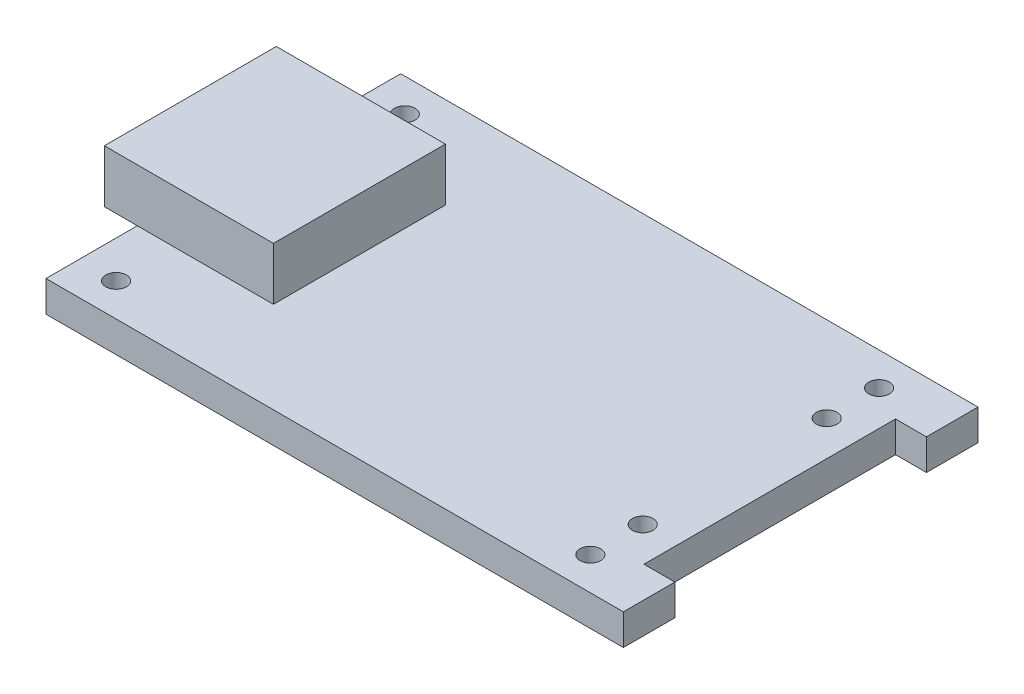
ISO-10303-21;
HEADER;
FILE_DESCRIPTION(('STEP AP214'),'2;1');
FILE_NAME('part.step','',(''),(''),'','','');
FILE_SCHEMA(('AUTOMOTIVE_DESIGN { 1 0 10303 214 1 1 1 1 }'));
ENDSEC;
DATA;
#1=APPLICATION_CONTEXT('core data for automotive mechanical design processes');
#2=APPLICATION_PROTOCOL_DEFINITION('international standard','automotive_design',2000,#1);
#3=PRODUCT_CONTEXT('',#1,'mechanical');
#4=PRODUCT('Part','Part','',(#3));
#5=PRODUCT_RELATED_PRODUCT_CATEGORY('part','',(#4));
#6=PRODUCT_DEFINITION_FORMATION('','',#4);
#7=PRODUCT_DEFINITION_CONTEXT('part definition',#1,'design');
#8=PRODUCT_DEFINITION('design','',#6,#7);
#9=PRODUCT_DEFINITION_SHAPE('','',#8);
#10=(LENGTH_UNIT() NAMED_UNIT(*) SI_UNIT(.MILLI.,.METRE.));
#11=(NAMED_UNIT(*) PLANE_ANGLE_UNIT() SI_UNIT($,.RADIAN.));
#12=(NAMED_UNIT(*) SI_UNIT($,.STERADIAN.) SOLID_ANGLE_UNIT());
#13=UNCERTAINTY_MEASURE_WITH_UNIT(LENGTH_MEASURE(1.E-05),#10,'distance_accuracy_value','');
#14=(GEOMETRIC_REPRESENTATION_CONTEXT(3) GLOBAL_UNCERTAINTY_ASSIGNED_CONTEXT((#13)) GLOBAL_UNIT_ASSIGNED_CONTEXT((#10,
#11,#12)) REPRESENTATION_CONTEXT('',''));
#15=CARTESIAN_POINT('',(0.,0.,0.));
#16=DIRECTION('',(0.,0.,1.));
#17=DIRECTION('',(1.,0.,0.));
#18=AXIS2_PLACEMENT_3D('',#15,#16,#17);
#19=CARTESIAN_POINT('',(28.,1.5,0.));
#20=DIRECTION('',(-1.,0.,0.));
#21=DIRECTION('',(0.,0.,1.));
#22=AXIS2_PLACEMENT_3D('',#19,#20,#21);
#23=PLANE('',#22);
#24=DIRECTION('',(0.,0.,-1.));
#25=VECTOR('',#24,1.);
#26=CARTESIAN_POINT('',(28.,0.,0.));
#27=LINE('',#26,#25);
#28=CARTESIAN_POINT('',(28.,0.,17.2));
#29=VERTEX_POINT('',#28);
#30=CARTESIAN_POINT('',(28.,0.,14.7));
#31=VERTEX_POINT('',#30);
#32=EDGE_CURVE('E177',#29,#31,#27,.T.);
#33=ORIENTED_EDGE('',*,*,#32,.T.);
#34=DIRECTION('',(0.,1.,0.));
#35=VECTOR('',#34,1.);
#36=CARTESIAN_POINT('',(28.,-8.5,14.7));
#37=LINE('',#36,#35);
#38=CARTESIAN_POINT('',(28.,1.5,14.7));
#39=VERTEX_POINT('',#38);
#40=EDGE_CURVE('E222',#31,#39,#37,.T.);
#41=ORIENTED_EDGE('',*,*,#40,.T.);
#42=DIRECTION('',(0.,0.,-1.));
#43=VECTOR('',#42,1.);
#44=CARTESIAN_POINT('',(28.,1.5,0.));
#45=LINE('',#44,#43);
#46=CARTESIAN_POINT('',(28.,1.5,17.2));
#47=VERTEX_POINT('',#46);
#48=EDGE_CURVE('E159',#47,#39,#45,.T.);
#49=ORIENTED_EDGE('',*,*,#48,.F.);
#50=DIRECTION('',(0.,-1.,0.));
#51=VECTOR('',#50,1.);
#52=CARTESIAN_POINT('',(28.,1.5,17.2));
#53=LINE('',#52,#51);
#54=EDGE_CURVE('E186',#47,#29,#53,.T.);
#55=ORIENTED_EDGE('',*,*,#54,.T.);
#56=EDGE_LOOP('',(#33,#41,#49,#55));
#57=FACE_BOUND('',#56,.T.);
#58=ADVANCED_FACE('F41',(#57),#23,.F.);
#59=CARTESIAN_POINT('',(0.,1.5,0.));
#60=DIRECTION('',(1.,0.,0.));
#61=DIRECTION('',(0.,0.,-1.));
#62=AXIS2_PLACEMENT_3D('',#59,#60,#61);
#63=PLANE('',#62);
#64=DIRECTION('',(0.,0.,1.));
#65=VECTOR('',#64,1.);
#66=CARTESIAN_POINT('',(0.,0.,0.));
#67=LINE('',#66,#65);
#68=CARTESIAN_POINT('',(0.,0.,0.));
#69=VERTEX_POINT('',#68);
#70=CARTESIAN_POINT('',(0.,0.,17.2));
#71=VERTEX_POINT('',#70);
#72=EDGE_CURVE('E170',#69,#71,#67,.T.);
#73=ORIENTED_EDGE('',*,*,#72,.T.);
#74=DIRECTION('',(0.,-1.,0.));
#75=VECTOR('',#74,1.);
#76=CARTESIAN_POINT('',(0.,1.5,17.2));
#77=LINE('',#76,#75);
#78=CARTESIAN_POINT('',(0.,1.5,17.2));
#79=VERTEX_POINT('',#78);
#80=EDGE_CURVE('E189',#79,#71,#77,.T.);
#81=ORIENTED_EDGE('',*,*,#80,.F.);
#82=DIRECTION('',(0.,0.,1.));
#83=VECTOR('',#82,1.);
#84=CARTESIAN_POINT('',(0.,1.5,0.));
#85=LINE('',#84,#83);
#86=CARTESIAN_POINT('',(0.,1.5,12.77));
#87=VERTEX_POINT('',#86);
#88=EDGE_CURVE('E182',#87,#79,#85,.T.);
#89=ORIENTED_EDGE('',*,*,#88,.F.);
#90=CARTESIAN_POINT('',(0.,1.5,4.43));
#91=VERTEX_POINT('',#90);
#92=EDGE_CURVE('E274',#91,#87,#85,.T.);
#93=ORIENTED_EDGE('',*,*,#92,.F.);
#94=CARTESIAN_POINT('',(0.,1.5,0.));
#95=VERTEX_POINT('',#94);
#96=EDGE_CURVE('E164',#95,#91,#85,.T.);
#97=ORIENTED_EDGE('',*,*,#96,.F.);
#98=DIRECTION('',(0.,-1.,0.));
#99=VECTOR('',#98,1.);
#100=CARTESIAN_POINT('',(0.,1.5,0.));
#101=LINE('',#100,#99);
#102=EDGE_CURVE('E169',#95,#69,#101,.T.);
#103=ORIENTED_EDGE('',*,*,#102,.T.);
#104=EDGE_LOOP('',(#73,#81,#89,#93,#97,#103));
#105=FACE_BOUND('',#104,.T.);
#106=ADVANCED_FACE('F43',(#105),#63,.F.);
#107=CARTESIAN_POINT('',(0.,1.5,17.2));
#108=DIRECTION('',(0.,0.,-1.));
#109=DIRECTION('',(-1.,0.,0.));
#110=AXIS2_PLACEMENT_3D('',#107,#108,#109);
#111=PLANE('',#110);
#112=DIRECTION('',(1.,0.,0.));
#113=VECTOR('',#112,1.);
#114=CARTESIAN_POINT('',(0.,0.,17.2));
#115=LINE('',#114,#113);
#116=EDGE_CURVE('E173',#71,#29,#115,.T.);
#117=ORIENTED_EDGE('',*,*,#116,.T.);
#118=ORIENTED_EDGE('',*,*,#54,.F.);
#119=DIRECTION('',(1.,0.,0.));
#120=VECTOR('',#119,1.);
#121=CARTESIAN_POINT('',(0.,1.5,17.2));
#122=LINE('',#121,#120);
#123=EDGE_CURVE('E160',#79,#47,#122,.T.);
#124=ORIENTED_EDGE('',*,*,#123,.F.);
#125=ORIENTED_EDGE('',*,*,#80,.T.);
#126=EDGE_LOOP('',(#117,#118,#124,#125));
#127=FACE_BOUND('',#126,.T.);
#128=ADVANCED_FACE('F285',(#127),#111,.F.);
#129=CARTESIAN_POINT('',(28.,1.5,2.5));
#130=VERTEX_POINT('',#129);
#131=CARTESIAN_POINT('',(28.,1.5,0.));
#132=VERTEX_POINT('',#131);
#133=EDGE_CURVE('E150',#130,#132,#45,.T.);
#134=ORIENTED_EDGE('',*,*,#133,.F.);
#135=DIRECTION('',(0.,1.,0.));
#136=VECTOR('',#135,1.);
#137=CARTESIAN_POINT('',(28.,-8.5,2.5));
#138=LINE('',#137,#136);
#139=CARTESIAN_POINT('',(28.,0.,2.5));
#140=VERTEX_POINT('',#139);
#141=EDGE_CURVE('E135',#140,#130,#138,.T.);
#142=ORIENTED_EDGE('',*,*,#141,.F.);
#143=CARTESIAN_POINT('',(28.,0.,0.));
#144=VERTEX_POINT('',#143);
#145=EDGE_CURVE('E176',#140,#144,#27,.T.);
#146=ORIENTED_EDGE('',*,*,#145,.T.);
#147=DIRECTION('',(0.,-1.,0.));
#148=VECTOR('',#147,1.);
#149=CARTESIAN_POINT('',(28.,1.5,0.));
#150=LINE('',#149,#148);
#151=EDGE_CURVE('E157',#132,#144,#150,.T.);
#152=ORIENTED_EDGE('',*,*,#151,.F.);
#153=EDGE_LOOP('',(#134,#142,#146,#152));
#154=FACE_BOUND('',#153,.T.);
#155=ADVANCED_FACE('F155',(#154),#23,.F.);
#156=CARTESIAN_POINT('',(0.,1.5,0.));
#157=DIRECTION('',(0.,0.,1.));
#158=DIRECTION('',(1.,0.,0.));
#159=AXIS2_PLACEMENT_3D('',#156,#157,#158);
#160=PLANE('',#159);
#161=DIRECTION('',(-1.,0.,0.));
#162=VECTOR('',#161,1.);
#163=CARTESIAN_POINT('',(0.,0.,0.));
#164=LINE('',#163,#162);
#165=EDGE_CURVE('E180',#144,#69,#164,.T.);
#166=ORIENTED_EDGE('',*,*,#165,.T.);
#167=ORIENTED_EDGE('',*,*,#102,.F.);
#168=DIRECTION('',(-1.,0.,0.));
#169=VECTOR('',#168,1.);
#170=CARTESIAN_POINT('',(0.,1.5,0.));
#171=LINE('',#170,#169);
#172=EDGE_CURVE('E163',#132,#95,#171,.T.);
#173=ORIENTED_EDGE('',*,*,#172,.F.);
#174=ORIENTED_EDGE('',*,*,#151,.T.);
#175=EDGE_LOOP('',(#166,#167,#173,#174));
#176=FACE_BOUND('',#175,.T.);
#177=ADVANCED_FACE('F312',(#176),#160,.F.);
#178=CARTESIAN_POINT('',(0.,1.5,0.));
#179=DIRECTION('',(0.,1.,0.));
#180=DIRECTION('',(0.,0.,1.));
#181=AXIS2_PLACEMENT_3D('',#178,#179,#180);
#182=PLANE('',#181);
#183=DIRECTION('',(1.,0.,0.));
#184=VECTOR('',#183,1.);
#185=CARTESIAN_POINT('',(26.5,1.5,14.7));
#186=LINE('',#185,#184);
#187=CARTESIAN_POINT('',(26.5,1.5,14.7));
#188=VERTEX_POINT('',#187);
#189=EDGE_CURVE('E145',#188,#39,#186,.T.);
#190=ORIENTED_EDGE('',*,*,#189,.F.);
#191=DIRECTION('',(0.,0.,1.));
#192=VECTOR('',#191,1.);
#193=CARTESIAN_POINT('',(26.5,1.5,2.5));
#194=LINE('',#193,#192);
#195=CARTESIAN_POINT('',(26.5,1.5,2.5));
#196=VERTEX_POINT('',#195);
#197=EDGE_CURVE('E153',#196,#188,#194,.T.);
#198=ORIENTED_EDGE('',*,*,#197,.F.);
#199=DIRECTION('',(-1.,0.,0.));
#200=VECTOR('',#199,1.);
#201=CARTESIAN_POINT('',(28.,1.5,2.5));
#202=LINE('',#201,#200);
#203=EDGE_CURVE('E138',#130,#196,#202,.T.);
#204=ORIENTED_EDGE('',*,*,#203,.F.);
#205=ORIENTED_EDGE('',*,*,#133,.T.);
#206=ORIENTED_EDGE('',*,*,#172,.T.);
#207=ORIENTED_EDGE('',*,*,#96,.T.);
#208=DIRECTION('',(-1.,0.,0.));
#209=VECTOR('',#208,1.);
#210=CARTESIAN_POINT('',(-1.6,1.5,4.43));
#211=LINE('',#210,#209);
#212=CARTESIAN_POINT('',(6.6,1.5,4.43));
#213=VERTEX_POINT('',#212);
#214=EDGE_CURVE('E64',#213,#91,#211,.T.);
#215=ORIENTED_EDGE('',*,*,#214,.F.);
#216=DIRECTION('',(0.,0.,-1.));
#217=VECTOR('',#216,1.);
#218=CARTESIAN_POINT('',(6.6,1.5,4.43));
#219=LINE('',#218,#217);
#220=CARTESIAN_POINT('',(6.6,1.5,12.77));
#221=VERTEX_POINT('',#220);
#222=EDGE_CURVE('E261',#221,#213,#219,.T.);
#223=ORIENTED_EDGE('',*,*,#222,.F.);
#224=DIRECTION('',(1.,0.,0.));
#225=VECTOR('',#224,1.);
#226=CARTESIAN_POINT('',(-1.6,1.5,12.77));
#227=LINE('',#226,#225);
#228=EDGE_CURVE('E192',#87,#221,#227,.T.);
#229=ORIENTED_EDGE('',*,*,#228,.F.);
#230=ORIENTED_EDGE('',*,*,#88,.T.);
#231=ORIENTED_EDGE('',*,*,#123,.T.);
#232=ORIENTED_EDGE('',*,*,#48,.T.);
#233=EDGE_LOOP('',(#190,#198,#204,#205,#206,#207,#215,#223,#229,#230,#231,#232));
#234=FACE_BOUND('',#233,.T.);
#235=CARTESIAN_POINT('',(24.8,1.5,13.06));
#236=DIRECTION('',(0.,1.,0.));
#237=DIRECTION('',(0.,0.,1.));
#238=AXIS2_PLACEMENT_3D('',#235,#236,#237);
#239=CIRCLE('',#238,0.499999999999999);
#240=CARTESIAN_POINT('',(24.8,1.5,13.56));
#241=VERTEX_POINT('',#240);
#242=EDGE_CURVE('E232',#241,#241,#239,.T.);
#243=ORIENTED_EDGE('',*,*,#242,.F.);
#244=EDGE_LOOP('',(#243));
#245=FACE_BOUND('',#244,.T.);
#246=CARTESIAN_POINT('',(24.8,1.5,4.14));
#247=DIRECTION('',(0.,1.,0.));
#248=DIRECTION('',(0.,0.,1.));
#249=AXIS2_PLACEMENT_3D('',#246,#247,#248);
#250=CIRCLE('',#249,0.499999999999999);
#251=CARTESIAN_POINT('',(24.8,1.5,4.64));
#252=VERTEX_POINT('',#251);
#253=EDGE_CURVE('E233',#252,#252,#250,.T.);
#254=ORIENTED_EDGE('',*,*,#253,.F.);
#255=EDGE_LOOP('',(#254));
#256=FACE_BOUND('',#255,.T.);
#257=CARTESIAN_POINT('',(24.8,1.5,1.6));
#258=DIRECTION('',(0.,1.,0.));
#259=DIRECTION('',(0.,0.,1.));
#260=AXIS2_PLACEMENT_3D('',#257,#258,#259);
#261=CIRCLE('',#260,0.499999999999999);
#262=CARTESIAN_POINT('',(24.8,1.5,2.1));
#263=VERTEX_POINT('',#262);
#264=EDGE_CURVE('E236',#263,#263,#261,.T.);
#265=ORIENTED_EDGE('',*,*,#264,.F.);
#266=EDGE_LOOP('',(#265));
#267=FACE_BOUND('',#266,.T.);
#268=CARTESIAN_POINT('',(1.8,1.5,15.6));
#269=DIRECTION('',(0.,1.,0.));
#270=DIRECTION('',(0.,0.,1.));
#271=AXIS2_PLACEMENT_3D('',#268,#269,#270);
#272=CIRCLE('',#271,0.5);
#273=CARTESIAN_POINT('',(1.8,1.5,16.1));
#274=VERTEX_POINT('',#273);
#275=EDGE_CURVE('E239',#274,#274,#272,.T.);
#276=ORIENTED_EDGE('',*,*,#275,.F.);
#277=EDGE_LOOP('',(#276));
#278=FACE_BOUND('',#277,.T.);
#279=CARTESIAN_POINT('',(24.8,1.5,15.6));
#280=DIRECTION('',(0.,1.,0.));
#281=DIRECTION('',(0.,0.,1.));
#282=AXIS2_PLACEMENT_3D('',#279,#280,#281);
#283=CIRCLE('',#282,0.499999999999999);
#284=CARTESIAN_POINT('',(24.8,1.5,16.1));
#285=VERTEX_POINT('',#284);
#286=EDGE_CURVE('E225',#285,#285,#283,.T.);
#287=ORIENTED_EDGE('',*,*,#286,.F.);
#288=EDGE_LOOP('',(#287));
#289=FACE_BOUND('',#288,.T.);
#290=CARTESIAN_POINT('',(1.8,1.5,1.6));
#291=DIRECTION('',(0.,1.,0.));
#292=DIRECTION('',(0.,0.,1.));
#293=AXIS2_PLACEMENT_3D('',#290,#291,#292);
#294=CIRCLE('',#293,0.5);
#295=CARTESIAN_POINT('',(1.8,1.5,2.1));
#296=VERTEX_POINT('',#295);
#297=EDGE_CURVE('E197',#296,#296,#294,.T.);
#298=ORIENTED_EDGE('',*,*,#297,.F.);
#299=EDGE_LOOP('',(#298));
#300=FACE_BOUND('',#299,.T.);
#301=ADVANCED_FACE('F148',(#234,#245,#256,#267,#278,#289,#300),#182,.T.);
#302=CARTESIAN_POINT('',(0.,0.,0.));
#303=DIRECTION('',(0.,1.,0.));
#304=DIRECTION('',(0.,0.,1.));
#305=AXIS2_PLACEMENT_3D('',#302,#303,#304);
#306=PLANE('',#305);
#307=CARTESIAN_POINT('',(24.8,0.,13.06));
#308=DIRECTION('',(0.,1.,0.));
#309=DIRECTION('',(0.,0.,1.));
#310=AXIS2_PLACEMENT_3D('',#307,#308,#309);
#311=CIRCLE('',#310,0.499999999999999);
#312=CARTESIAN_POINT('',(24.8,0.,13.56));
#313=VERTEX_POINT('',#312);
#314=EDGE_CURVE('E209',#313,#313,#311,.T.);
#315=ORIENTED_EDGE('',*,*,#314,.T.);
#316=EDGE_LOOP('',(#315));
#317=FACE_BOUND('',#316,.T.);
#318=CARTESIAN_POINT('',(24.8,0.,4.14));
#319=DIRECTION('',(0.,1.,0.));
#320=DIRECTION('',(0.,0.,1.));
#321=AXIS2_PLACEMENT_3D('',#318,#319,#320);
#322=CIRCLE('',#321,0.499999999999999);
#323=CARTESIAN_POINT('',(24.8,0.,4.64));
#324=VERTEX_POINT('',#323);
#325=EDGE_CURVE('E206',#324,#324,#322,.T.);
#326=ORIENTED_EDGE('',*,*,#325,.T.);
#327=EDGE_LOOP('',(#326));
#328=FACE_BOUND('',#327,.T.);
#329=CARTESIAN_POINT('',(24.8,0.,1.6));
#330=DIRECTION('',(0.,1.,0.));
#331=DIRECTION('',(0.,0.,1.));
#332=AXIS2_PLACEMENT_3D('',#329,#330,#331);
#333=CIRCLE('',#332,0.499999999999999);
#334=CARTESIAN_POINT('',(24.8,0.,2.1));
#335=VERTEX_POINT('',#334);
#336=EDGE_CURVE('E203',#335,#335,#333,.T.);
#337=ORIENTED_EDGE('',*,*,#336,.T.);
#338=EDGE_LOOP('',(#337));
#339=FACE_BOUND('',#338,.T.);
#340=CARTESIAN_POINT('',(1.8,0.,15.6));
#341=DIRECTION('',(0.,1.,0.));
#342=DIRECTION('',(0.,0.,1.));
#343=AXIS2_PLACEMENT_3D('',#340,#341,#342);
#344=CIRCLE('',#343,0.5);
#345=CARTESIAN_POINT('',(1.8,0.,16.1));
#346=VERTEX_POINT('',#345);
#347=EDGE_CURVE('E200',#346,#346,#344,.T.);
#348=ORIENTED_EDGE('',*,*,#347,.T.);
#349=EDGE_LOOP('',(#348));
#350=FACE_BOUND('',#349,.T.);
#351=CARTESIAN_POINT('',(24.8,0.,15.6));
#352=DIRECTION('',(0.,1.,0.));
#353=DIRECTION('',(0.,0.,1.));
#354=AXIS2_PLACEMENT_3D('',#351,#352,#353);
#355=CIRCLE('',#354,0.499999999999999);
#356=CARTESIAN_POINT('',(24.8,0.,16.1));
#357=VERTEX_POINT('',#356);
#358=EDGE_CURVE('E196',#357,#357,#355,.T.);
#359=ORIENTED_EDGE('',*,*,#358,.T.);
#360=EDGE_LOOP('',(#359));
#361=FACE_BOUND('',#360,.T.);
#362=CARTESIAN_POINT('',(1.8,0.,1.6));
#363=DIRECTION('',(0.,1.,0.));
#364=DIRECTION('',(0.,0.,1.));
#365=AXIS2_PLACEMENT_3D('',#362,#363,#364);
#366=CIRCLE('',#365,0.5);
#367=CARTESIAN_POINT('',(1.8,0.,2.1));
#368=VERTEX_POINT('',#367);
#369=EDGE_CURVE('E193',#368,#368,#366,.T.);
#370=ORIENTED_EDGE('',*,*,#369,.T.);
#371=EDGE_LOOP('',(#370));
#372=FACE_BOUND('',#371,.T.);
#373=DIRECTION('',(0.,0.,1.));
#374=VECTOR('',#373,1.);
#375=CARTESIAN_POINT('',(26.5,0.,0.));
#376=LINE('',#375,#374);
#377=CARTESIAN_POINT('',(26.5,0.,2.5));
#378=VERTEX_POINT('',#377);
#379=CARTESIAN_POINT('',(26.5,0.,14.7));
#380=VERTEX_POINT('',#379);
#381=EDGE_CURVE('E49',#378,#380,#376,.T.);
#382=ORIENTED_EDGE('',*,*,#381,.T.);
#383=DIRECTION('',(1.,0.,0.));
#384=VECTOR('',#383,1.);
#385=CARTESIAN_POINT('',(0.,0.,14.7));
#386=LINE('',#385,#384);
#387=EDGE_CURVE('E11',#380,#31,#386,.T.);
#388=ORIENTED_EDGE('',*,*,#387,.T.);
#389=ORIENTED_EDGE('',*,*,#32,.F.);
#390=ORIENTED_EDGE('',*,*,#116,.F.);
#391=ORIENTED_EDGE('',*,*,#72,.F.);
#392=ORIENTED_EDGE('',*,*,#165,.F.);
#393=ORIENTED_EDGE('',*,*,#145,.F.);
#394=DIRECTION('',(-1.,0.,0.));
#395=VECTOR('',#394,1.);
#396=CARTESIAN_POINT('',(0.,0.,2.5));
#397=LINE('',#396,#395);
#398=EDGE_CURVE('E141',#140,#378,#397,.T.);
#399=ORIENTED_EDGE('',*,*,#398,.T.);
#400=EDGE_LOOP('',(#382,#388,#389,#390,#391,#392,#393,#399));
#401=FACE_BOUND('',#400,.T.);
#402=ADVANCED_FACE('F215',(#317,#328,#339,#350,#361,#372,#401),#306,.F.);
#403=CARTESIAN_POINT('',(0.,1.5,0.));
#404=DIRECTION('',(0.,1.,0.));
#405=DIRECTION('',(0.,0.,1.));
#406=AXIS2_PLACEMENT_3D('',#403,#404,#405);
#407=PLANE('',#406);
#408=CARTESIAN_POINT('',(-1.6,1.5,4.43));
#409=VERTEX_POINT('',#408);
#410=EDGE_CURVE('E263',#91,#409,#211,.T.);
#411=ORIENTED_EDGE('',*,*,#410,.F.);
#412=ORIENTED_EDGE('',*,*,#92,.T.);
#413=CARTESIAN_POINT('',(-1.6,1.5,12.77));
#414=VERTEX_POINT('',#413);
#415=EDGE_CURVE('E258',#414,#87,#227,.T.);
#416=ORIENTED_EDGE('',*,*,#415,.F.);
#417=DIRECTION('',(0.,0.,1.));
#418=VECTOR('',#417,1.);
#419=CARTESIAN_POINT('',(-1.6,1.5,4.43));
#420=LINE('',#419,#418);
#421=EDGE_CURVE('E212',#409,#414,#420,.T.);
#422=ORIENTED_EDGE('',*,*,#421,.F.);
#423=EDGE_LOOP('',(#411,#412,#416,#422));
#424=FACE_BOUND('',#423,.T.);
#425=ADVANCED_FACE('F336',(#424),#407,.F.);
#426=CARTESIAN_POINT('',(-1.6,4.06,4.43));
#427=DIRECTION('',(1.,0.,0.));
#428=DIRECTION('',(0.,0.,-1.));
#429=AXIS2_PLACEMENT_3D('',#426,#427,#428);
#430=PLANE('',#429);
#431=ORIENTED_EDGE('',*,*,#421,.T.);
#432=DIRECTION('',(0.,-1.,0.));
#433=VECTOR('',#432,1.);
#434=CARTESIAN_POINT('',(-1.6,4.06,12.77));
#435=LINE('',#434,#433);
#436=CARTESIAN_POINT('',(-1.6,4.06,12.77));
#437=VERTEX_POINT('',#436);
#438=EDGE_CURVE('E174',#437,#414,#435,.T.);
#439=ORIENTED_EDGE('',*,*,#438,.F.);
#440=DIRECTION('',(0.,0.,1.));
#441=VECTOR('',#440,1.);
#442=CARTESIAN_POINT('',(-1.6,4.06,4.43));
#443=LINE('',#442,#441);
#444=CARTESIAN_POINT('',(-1.6,4.06,4.43));
#445=VERTEX_POINT('',#444);
#446=EDGE_CURVE('E246',#445,#437,#443,.T.);
#447=ORIENTED_EDGE('',*,*,#446,.F.);
#448=DIRECTION('',(0.,-1.,0.));
#449=VECTOR('',#448,1.);
#450=CARTESIAN_POINT('',(-1.6,4.06,4.43));
#451=LINE('',#450,#449);
#452=EDGE_CURVE('E255',#445,#409,#451,.T.);
#453=ORIENTED_EDGE('',*,*,#452,.T.);
#454=EDGE_LOOP('',(#431,#439,#447,#453));
#455=FACE_BOUND('',#454,.T.);
#456=ADVANCED_FACE('F340',(#455),#430,.F.);
#457=CARTESIAN_POINT('',(-1.6,4.06,12.77));
#458=DIRECTION('',(0.,0.,-1.));
#459=DIRECTION('',(-1.,0.,0.));
#460=AXIS2_PLACEMENT_3D('',#457,#458,#459);
#461=PLANE('',#460);
#462=ORIENTED_EDGE('',*,*,#415,.T.);
#463=ORIENTED_EDGE('',*,*,#228,.T.);
#464=DIRECTION('',(0.,-1.,0.));
#465=VECTOR('',#464,1.);
#466=CARTESIAN_POINT('',(6.6,4.06,12.77));
#467=LINE('',#466,#465);
#468=CARTESIAN_POINT('',(6.6,4.06,12.77));
#469=VERTEX_POINT('',#468);
#470=EDGE_CURVE('E270',#469,#221,#467,.T.);
#471=ORIENTED_EDGE('',*,*,#470,.F.);
#472=DIRECTION('',(1.,0.,0.));
#473=VECTOR('',#472,1.);
#474=CARTESIAN_POINT('',(-1.6,4.06,12.77));
#475=LINE('',#474,#473);
#476=EDGE_CURVE('E249',#437,#469,#475,.T.);
#477=ORIENTED_EDGE('',*,*,#476,.F.);
#478=ORIENTED_EDGE('',*,*,#438,.T.);
#479=EDGE_LOOP('',(#462,#463,#471,#477,#478));
#480=FACE_BOUND('',#479,.T.);
#481=ADVANCED_FACE('F350',(#480),#461,.F.);
#482=CARTESIAN_POINT('',(6.6,4.06,4.43));
#483=DIRECTION('',(-1.,0.,0.));
#484=DIRECTION('',(0.,0.,1.));
#485=AXIS2_PLACEMENT_3D('',#482,#483,#484);
#486=PLANE('',#485);
#487=ORIENTED_EDGE('',*,*,#222,.T.);
#488=DIRECTION('',(0.,-1.,0.));
#489=VECTOR('',#488,1.);
#490=CARTESIAN_POINT('',(6.6,4.06,4.43));
#491=LINE('',#490,#489);
#492=CARTESIAN_POINT('',(6.6,4.06,4.43));
#493=VERTEX_POINT('',#492);
#494=EDGE_CURVE('E267',#493,#213,#491,.T.);
#495=ORIENTED_EDGE('',*,*,#494,.F.);
#496=DIRECTION('',(0.,0.,-1.));
#497=VECTOR('',#496,1.);
#498=CARTESIAN_POINT('',(6.6,4.06,4.43));
#499=LINE('',#498,#497);
#500=EDGE_CURVE('E251',#469,#493,#499,.T.);
#501=ORIENTED_EDGE('',*,*,#500,.F.);
#502=ORIENTED_EDGE('',*,*,#470,.T.);
#503=EDGE_LOOP('',(#487,#495,#501,#502));
#504=FACE_BOUND('',#503,.T.);
#505=ADVANCED_FACE('F359',(#504),#486,.F.);
#506=CARTESIAN_POINT('',(-1.6,4.06,4.43));
#507=DIRECTION('',(0.,0.,1.));
#508=DIRECTION('',(1.,0.,0.));
#509=AXIS2_PLACEMENT_3D('',#506,#507,#508);
#510=PLANE('',#509);
#511=ORIENTED_EDGE('',*,*,#214,.T.);
#512=ORIENTED_EDGE('',*,*,#410,.T.);
#513=ORIENTED_EDGE('',*,*,#452,.F.);
#514=DIRECTION('',(-1.,0.,0.));
#515=VECTOR('',#514,1.);
#516=CARTESIAN_POINT('',(-1.6,4.06,4.43));
#517=LINE('',#516,#515);
#518=EDGE_CURVE('E253',#493,#445,#517,.T.);
#519=ORIENTED_EDGE('',*,*,#518,.F.);
#520=ORIENTED_EDGE('',*,*,#494,.T.);
#521=EDGE_LOOP('',(#511,#512,#513,#519,#520));
#522=FACE_BOUND('',#521,.T.);
#523=ADVANCED_FACE('F368',(#522),#510,.F.);
#524=CARTESIAN_POINT('',(0.,4.06,0.));
#525=DIRECTION('',(0.,1.,0.));
#526=DIRECTION('',(0.,0.,1.));
#527=AXIS2_PLACEMENT_3D('',#524,#525,#526);
#528=PLANE('',#527);
#529=ORIENTED_EDGE('',*,*,#446,.T.);
#530=ORIENTED_EDGE('',*,*,#476,.T.);
#531=ORIENTED_EDGE('',*,*,#500,.T.);
#532=ORIENTED_EDGE('',*,*,#518,.T.);
#533=EDGE_LOOP('',(#529,#530,#531,#532));
#534=FACE_BOUND('',#533,.T.);
#535=ADVANCED_FACE('F377',(#534),#528,.T.);
#536=CARTESIAN_POINT('',(1.8,-8.5,1.6));
#537=DIRECTION('',(0.,1.,0.));
#538=DIRECTION('',(0.,0.,1.));
#539=AXIS2_PLACEMENT_3D('',#536,#537,#538);
#540=CYLINDRICAL_SURFACE('',#539,0.5);
#541=ORIENTED_EDGE('',*,*,#297,.T.);
#542=EDGE_LOOP('',(#541));
#543=FACE_BOUND('',#542,.T.);
#544=ORIENTED_EDGE('',*,*,#369,.F.);
#545=EDGE_LOOP('',(#544));
#546=FACE_BOUND('',#545,.T.);
#547=ADVANCED_FACE('F386',(#543,#546),#540,.F.);
#548=CARTESIAN_POINT('',(24.8,-8.5,15.6));
#549=DIRECTION('',(0.,1.,0.));
#550=DIRECTION('',(0.,0.,1.));
#551=AXIS2_PLACEMENT_3D('',#548,#549,#550);
#552=CYLINDRICAL_SURFACE('',#551,0.499999999999999);
#553=ORIENTED_EDGE('',*,*,#286,.T.);
#554=EDGE_LOOP('',(#553));
#555=FACE_BOUND('',#554,.T.);
#556=ORIENTED_EDGE('',*,*,#358,.F.);
#557=EDGE_LOOP('',(#556));
#558=FACE_BOUND('',#557,.T.);
#559=ADVANCED_FACE('F395',(#555,#558),#552,.F.);
#560=CARTESIAN_POINT('',(1.8,-8.5,15.6));
#561=DIRECTION('',(0.,1.,0.));
#562=DIRECTION('',(0.,0.,1.));
#563=AXIS2_PLACEMENT_3D('',#560,#561,#562);
#564=CYLINDRICAL_SURFACE('',#563,0.5);
#565=ORIENTED_EDGE('',*,*,#275,.T.);
#566=EDGE_LOOP('',(#565));
#567=FACE_BOUND('',#566,.T.);
#568=ORIENTED_EDGE('',*,*,#347,.F.);
#569=EDGE_LOOP('',(#568));
#570=FACE_BOUND('',#569,.T.);
#571=ADVANCED_FACE('F404',(#567,#570),#564,.F.);
#572=CARTESIAN_POINT('',(24.8,-8.5,1.6));
#573=DIRECTION('',(0.,1.,0.));
#574=DIRECTION('',(0.,0.,1.));
#575=AXIS2_PLACEMENT_3D('',#572,#573,#574);
#576=CYLINDRICAL_SURFACE('',#575,0.499999999999999);
#577=ORIENTED_EDGE('',*,*,#264,.T.);
#578=EDGE_LOOP('',(#577));
#579=FACE_BOUND('',#578,.T.);
#580=ORIENTED_EDGE('',*,*,#336,.F.);
#581=EDGE_LOOP('',(#580));
#582=FACE_BOUND('',#581,.T.);
#583=ADVANCED_FACE('F413',(#579,#582),#576,.F.);
#584=CARTESIAN_POINT('',(24.8,-8.5,4.14));
#585=DIRECTION('',(0.,1.,0.));
#586=DIRECTION('',(0.,0.,1.));
#587=AXIS2_PLACEMENT_3D('',#584,#585,#586);
#588=CYLINDRICAL_SURFACE('',#587,0.499999999999999);
#589=ORIENTED_EDGE('',*,*,#253,.T.);
#590=EDGE_LOOP('',(#589));
#591=FACE_BOUND('',#590,.T.);
#592=ORIENTED_EDGE('',*,*,#325,.F.);
#593=EDGE_LOOP('',(#592));
#594=FACE_BOUND('',#593,.T.);
#595=ADVANCED_FACE('F302',(#591,#594),#588,.F.);
#596=CARTESIAN_POINT('',(24.8,-8.5,13.06));
#597=DIRECTION('',(0.,1.,0.));
#598=DIRECTION('',(0.,0.,1.));
#599=AXIS2_PLACEMENT_3D('',#596,#597,#598);
#600=CYLINDRICAL_SURFACE('',#599,0.499999999999999);
#601=ORIENTED_EDGE('',*,*,#242,.T.);
#602=EDGE_LOOP('',(#601));
#603=FACE_BOUND('',#602,.T.);
#604=ORIENTED_EDGE('',*,*,#314,.F.);
#605=EDGE_LOOP('',(#604));
#606=FACE_BOUND('',#605,.T.);
#607=ADVANCED_FACE('F294',(#603,#606),#600,.F.);
#608=CARTESIAN_POINT('',(26.5,-8.5,14.7));
#609=DIRECTION('',(0.,0.,1.));
#610=DIRECTION('',(1.,0.,0.));
#611=AXIS2_PLACEMENT_3D('',#608,#609,#610);
#612=PLANE('',#611);
#613=DIRECTION('',(0.,1.,0.));
#614=VECTOR('',#613,1.);
#615=CARTESIAN_POINT('',(26.5,-8.5,14.7));
#616=LINE('',#615,#614);
#617=EDGE_CURVE('E220',#380,#188,#616,.T.);
#618=ORIENTED_EDGE('',*,*,#617,.T.);
#619=ORIENTED_EDGE('',*,*,#189,.T.);
#620=ORIENTED_EDGE('',*,*,#40,.F.);
#621=ORIENTED_EDGE('',*,*,#387,.F.);
#622=EDGE_LOOP('',(#618,#619,#620,#621));
#623=FACE_BOUND('',#622,.T.);
#624=ADVANCED_FACE('F292',(#623),#612,.F.);
#625=CARTESIAN_POINT('',(26.5,-8.5,2.5));
#626=DIRECTION('',(-1.,0.,0.));
#627=DIRECTION('',(0.,0.,1.));
#628=AXIS2_PLACEMENT_3D('',#625,#626,#627);
#629=PLANE('',#628);
#630=DIRECTION('',(0.,1.,0.));
#631=VECTOR('',#630,1.);
#632=CARTESIAN_POINT('',(26.5,-8.5,2.5));
#633=LINE('',#632,#631);
#634=EDGE_CURVE('E56',#378,#196,#633,.T.);
#635=ORIENTED_EDGE('',*,*,#634,.T.);
#636=ORIENTED_EDGE('',*,*,#197,.T.);
#637=ORIENTED_EDGE('',*,*,#617,.F.);
#638=ORIENTED_EDGE('',*,*,#381,.F.);
#639=EDGE_LOOP('',(#635,#636,#637,#638));
#640=FACE_BOUND('',#639,.T.);
#641=ADVANCED_FACE('F219',(#640),#629,.F.);
#642=CARTESIAN_POINT('',(28.,-8.5,2.5));
#643=DIRECTION('',(0.,0.,-1.));
#644=DIRECTION('',(-1.,0.,0.));
#645=AXIS2_PLACEMENT_3D('',#642,#643,#644);
#646=PLANE('',#645);
#647=ORIENTED_EDGE('',*,*,#141,.T.);
#648=ORIENTED_EDGE('',*,*,#203,.T.);
#649=ORIENTED_EDGE('',*,*,#634,.F.);
#650=ORIENTED_EDGE('',*,*,#398,.F.);
#651=EDGE_LOOP('',(#647,#648,#649,#650));
#652=FACE_BOUND('',#651,.T.);
#653=ADVANCED_FACE('F137',(#652),#646,.F.);
#654=CLOSED_SHELL('',(#58,#106,#128,#155,#177,#301,#402,#425,#456,#481,#505,#523,#535,#547,#559,
#571,#583,#595,#607,#624,#641,#653));
#655=MANIFOLD_SOLID_BREP('B2',#654);
#656=ADVANCED_BREP_SHAPE_REPRESENTATION('',(#18,#655),#14);
#657=SHAPE_DEFINITION_REPRESENTATION(#9,#656);
ENDSEC;
END-ISO-10303-21;
